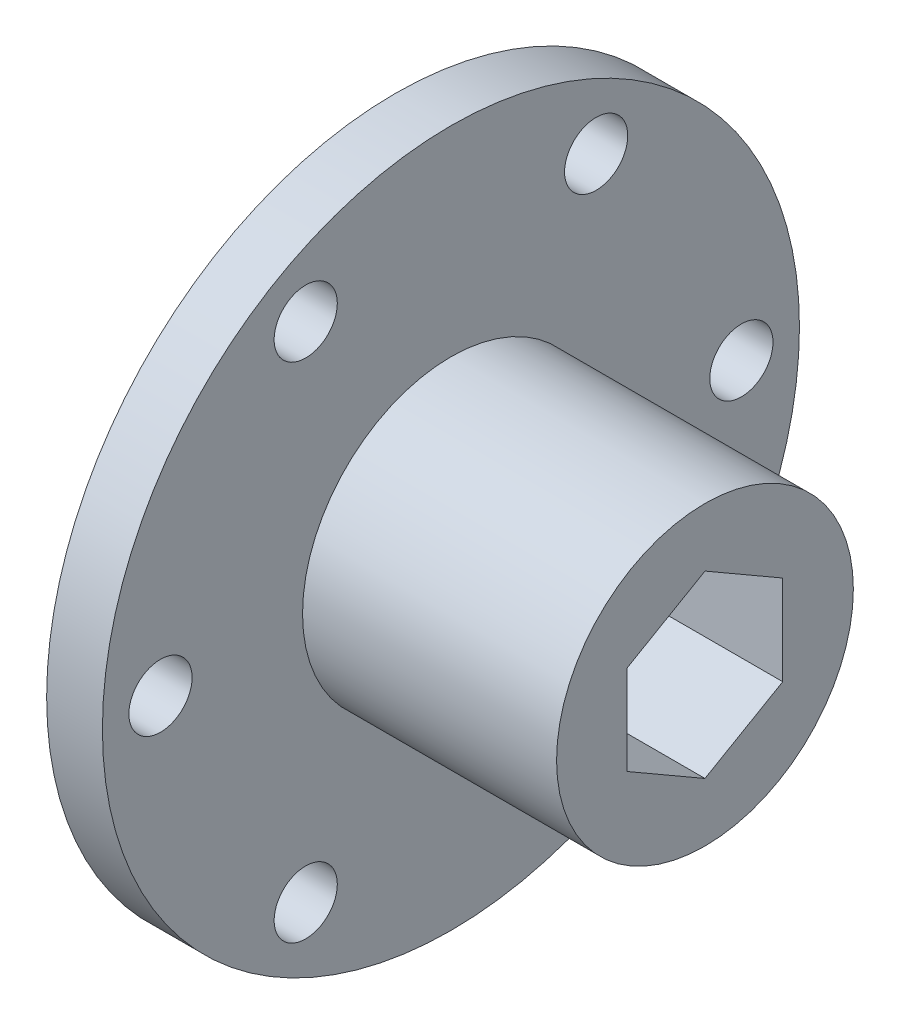
ISO-10303-21;
HEADER;
FILE_DESCRIPTION(('STEP AP214'),'2;1');
FILE_NAME('part.step','',(''),(''),'','','');
FILE_SCHEMA(('AUTOMOTIVE_DESIGN { 1 0 10303 214 1 1 1 1 }'));
ENDSEC;
DATA;
#1=APPLICATION_CONTEXT('core data for automotive mechanical design processes');
#2=APPLICATION_PROTOCOL_DEFINITION('international standard','automotive_design',2000,#1);
#3=PRODUCT_CONTEXT('',#1,'mechanical');
#4=PRODUCT('Part','Part','',(#3));
#5=PRODUCT_RELATED_PRODUCT_CATEGORY('part','',(#4));
#6=PRODUCT_DEFINITION_FORMATION('','',#4);
#7=PRODUCT_DEFINITION_CONTEXT('part definition',#1,'design');
#8=PRODUCT_DEFINITION('design','',#6,#7);
#9=PRODUCT_DEFINITION_SHAPE('','',#8);
#10=(LENGTH_UNIT() NAMED_UNIT(*) SI_UNIT(.MILLI.,.METRE.));
#11=(NAMED_UNIT(*) PLANE_ANGLE_UNIT() SI_UNIT($,.RADIAN.));
#12=(NAMED_UNIT(*) SI_UNIT($,.STERADIAN.) SOLID_ANGLE_UNIT());
#13=UNCERTAINTY_MEASURE_WITH_UNIT(LENGTH_MEASURE(1.E-05),#10,'distance_accuracy_value','');
#14=(GEOMETRIC_REPRESENTATION_CONTEXT(3) GLOBAL_UNCERTAINTY_ASSIGNED_CONTEXT((#13)) GLOBAL_UNIT_ASSIGNED_CONTEXT((#10,
#11,#12)) REPRESENTATION_CONTEXT('',''));
#15=CARTESIAN_POINT('',(0.,0.,0.));
#16=DIRECTION('',(0.,0.,1.));
#17=DIRECTION('',(1.,0.,0.));
#18=AXIS2_PLACEMENT_3D('',#15,#16,#17);
#19=CARTESIAN_POINT('',(-13.0350662460568,0.,0.));
#20=DIRECTION('',(1.,0.,0.));
#21=DIRECTION('',(0.,0.,-1.));
#22=AXIS2_PLACEMENT_3D('',#19,#20,#21);
#23=PLANE('',#22);
#24=CARTESIAN_POINT('',(-13.0350662460568,-20.6222299276169,11.90625));
#25=DIRECTION('',(1.,0.,0.));
#26=DIRECTION('',(0.,0.,-1.));
#27=AXIS2_PLACEMENT_3D('',#24,#25,#26);
#28=CIRCLE('',#27,2.59080000000001);
#29=CARTESIAN_POINT('',(-13.0350662460568,-20.6222299276169,9.31544999999996));
#30=VERTEX_POINT('',#29);
#31=EDGE_CURVE('E220',#30,#30,#28,.T.);
#32=ORIENTED_EDGE('',*,*,#31,.F.);
#33=EDGE_LOOP('',(#32));
#34=FACE_BOUND('',#33,.T.);
#35=CARTESIAN_POINT('',(-13.0350662460568,-20.6222299276169,-11.90625));
#36=DIRECTION('',(1.,0.,0.));
#37=DIRECTION('',(0.,0.,-1.));
#38=AXIS2_PLACEMENT_3D('',#35,#36,#37);
#39=CIRCLE('',#38,2.59080000000001);
#40=CARTESIAN_POINT('',(-13.0350662460568,-20.6222299276169,-14.49705));
#41=VERTEX_POINT('',#40);
#42=EDGE_CURVE('E230',#41,#41,#39,.T.);
#43=ORIENTED_EDGE('',*,*,#42,.F.);
#44=EDGE_LOOP('',(#43));
#45=FACE_BOUND('',#44,.T.);
#46=CARTESIAN_POINT('',(-13.0350662460568,0.,-23.8125));
#47=DIRECTION('',(1.,0.,0.));
#48=DIRECTION('',(0.,0.,-1.));
#49=AXIS2_PLACEMENT_3D('',#46,#47,#48);
#50=CIRCLE('',#49,2.59080000000001);
#51=CARTESIAN_POINT('',(-13.0350662460568,0.,-26.4033));
#52=VERTEX_POINT('',#51);
#53=EDGE_CURVE('E236',#52,#52,#50,.T.);
#54=ORIENTED_EDGE('',*,*,#53,.F.);
#55=EDGE_LOOP('',(#54));
#56=FACE_BOUND('',#55,.T.);
#57=CARTESIAN_POINT('',(-13.0350662460568,20.6222299276169,-11.90625));
#58=DIRECTION('',(1.,0.,0.));
#59=DIRECTION('',(0.,0.,-1.));
#60=AXIS2_PLACEMENT_3D('',#57,#58,#59);
#61=CIRCLE('',#60,2.59080000000001);
#62=CARTESIAN_POINT('',(-13.0350662460568,20.6222299276169,-14.49705));
#63=VERTEX_POINT('',#62);
#64=EDGE_CURVE('E242',#63,#63,#61,.T.);
#65=ORIENTED_EDGE('',*,*,#64,.F.);
#66=EDGE_LOOP('',(#65));
#67=FACE_BOUND('',#66,.T.);
#68=CARTESIAN_POINT('',(-13.0350662460568,20.6222299276169,11.90625));
#69=DIRECTION('',(1.,0.,0.));
#70=DIRECTION('',(0.,0.,-1.));
#71=AXIS2_PLACEMENT_3D('',#68,#69,#70);
#72=CIRCLE('',#71,2.59080000000001);
#73=CARTESIAN_POINT('',(-13.0350662460568,20.6222299276169,9.31544999999999));
#74=VERTEX_POINT('',#73);
#75=EDGE_CURVE('E248',#74,#74,#72,.T.);
#76=ORIENTED_EDGE('',*,*,#75,.F.);
#77=EDGE_LOOP('',(#76));
#78=FACE_BOUND('',#77,.T.);
#79=CARTESIAN_POINT('',(-13.0350662460568,0.,23.8125));
#80=DIRECTION('',(1.,0.,0.));
#81=DIRECTION('',(0.,0.,-1.));
#82=AXIS2_PLACEMENT_3D('',#79,#80,#81);
#83=CIRCLE('',#82,2.59080000000001);
#84=CARTESIAN_POINT('',(-13.0350662460568,0.,21.2217));
#85=VERTEX_POINT('',#84);
#86=EDGE_CURVE('E111',#85,#85,#83,.T.);
#87=ORIENTED_EDGE('',*,*,#86,.F.);
#88=EDGE_LOOP('',(#87));
#89=FACE_BOUND('',#88,.T.);
#90=CARTESIAN_POINT('',(-13.0350662460568,0.,0.));
#91=DIRECTION('',(1.,0.,0.));
#92=DIRECTION('',(0.,0.,-1.));
#93=AXIS2_PLACEMENT_3D('',#90,#91,#92);
#94=CIRCLE('',#93,28.575);
#95=CARTESIAN_POINT('',(-13.0350662460568,0.,-28.575));
#96=VERTEX_POINT('',#95);
#97=EDGE_CURVE('E41',#96,#96,#94,.T.);
#98=ORIENTED_EDGE('',*,*,#97,.T.);
#99=EDGE_LOOP('',(#98));
#100=FACE_BOUND('',#99,.T.);
#101=CARTESIAN_POINT('',(-13.0350662460568,0.,0.));
#102=DIRECTION('',(1.,0.,0.));
#103=DIRECTION('',(0.,0.,-1.));
#104=AXIS2_PLACEMENT_3D('',#101,#102,#103);
#105=CIRCLE('',#104,12.1666);
#106=CARTESIAN_POINT('',(-13.0350662460568,0.,-12.1666));
#107=VERTEX_POINT('',#106);
#108=EDGE_CURVE('E134',#107,#107,#105,.T.);
#109=ORIENTED_EDGE('',*,*,#108,.F.);
#110=EDGE_LOOP('',(#109));
#111=FACE_BOUND('',#110,.T.);
#112=ADVANCED_FACE('F33',(#34,#45,#56,#67,#78,#89,#100,#111),#23,.T.);
#113=CARTESIAN_POINT('',(-17.6070662460568,0.,0.));
#114=DIRECTION('',(1.,0.,0.));
#115=DIRECTION('',(0.,0.,-1.));
#116=AXIS2_PLACEMENT_3D('',#113,#114,#115);
#117=CYLINDRICAL_SURFACE('',#116,28.575);
#118=CARTESIAN_POINT('',(-17.6070662460568,0.,0.));
#119=DIRECTION('',(1.,0.,0.));
#120=DIRECTION('',(0.,0.,-1.));
#121=AXIS2_PLACEMENT_3D('',#118,#119,#120);
#122=CIRCLE('',#121,28.575);
#123=CARTESIAN_POINT('',(-17.6070662460568,0.,-28.575));
#124=VERTEX_POINT('',#123);
#125=EDGE_CURVE('E11',#124,#124,#122,.T.);
#126=ORIENTED_EDGE('',*,*,#125,.T.);
#127=EDGE_LOOP('',(#126));
#128=FACE_BOUND('',#127,.T.);
#129=ORIENTED_EDGE('',*,*,#97,.F.);
#130=EDGE_LOOP('',(#129));
#131=FACE_BOUND('',#130,.T.);
#132=ADVANCED_FACE('F35',(#128,#131),#117,.T.);
#133=CARTESIAN_POINT('',(-17.6070662460568,28.575,0.));
#134=DIRECTION('',(-1.,0.,0.));
#135=DIRECTION('',(0.,0.,1.));
#136=AXIS2_PLACEMENT_3D('',#133,#134,#135);
#137=PLANE('',#136);
#138=CARTESIAN_POINT('',(-17.6070662460568,-20.6222299276169,11.90625));
#139=DIRECTION('',(-1.,0.,0.));
#140=DIRECTION('',(0.,0.,1.));
#141=AXIS2_PLACEMENT_3D('',#138,#139,#140);
#142=CIRCLE('',#141,2.59080000000001);
#143=CARTESIAN_POINT('',(-17.6070662460568,-20.6222299276169,14.49705));
#144=VERTEX_POINT('',#143);
#145=EDGE_CURVE('E223',#144,#144,#142,.T.);
#146=ORIENTED_EDGE('',*,*,#145,.F.);
#147=EDGE_LOOP('',(#146));
#148=FACE_BOUND('',#147,.T.);
#149=CARTESIAN_POINT('',(-17.6070662460568,-20.6222299276169,-11.90625));
#150=DIRECTION('',(-1.,0.,0.));
#151=DIRECTION('',(0.,0.,1.));
#152=AXIS2_PLACEMENT_3D('',#149,#150,#151);
#153=CIRCLE('',#152,2.59080000000001);
#154=CARTESIAN_POINT('',(-17.6070662460568,-20.6222299276169,-9.31544999999999));
#155=VERTEX_POINT('',#154);
#156=EDGE_CURVE('E225',#155,#155,#153,.T.);
#157=ORIENTED_EDGE('',*,*,#156,.F.);
#158=EDGE_LOOP('',(#157));
#159=FACE_BOUND('',#158,.T.);
#160=CARTESIAN_POINT('',(-17.6070662460568,0.,-23.8125));
#161=DIRECTION('',(-1.,0.,0.));
#162=DIRECTION('',(0.,0.,1.));
#163=AXIS2_PLACEMENT_3D('',#160,#161,#162);
#164=CIRCLE('',#163,2.59080000000001);
#165=CARTESIAN_POINT('',(-17.6070662460568,0.,-21.2217));
#166=VERTEX_POINT('',#165);
#167=EDGE_CURVE('E233',#166,#166,#164,.T.);
#168=ORIENTED_EDGE('',*,*,#167,.F.);
#169=EDGE_LOOP('',(#168));
#170=FACE_BOUND('',#169,.T.);
#171=CARTESIAN_POINT('',(-17.6070662460568,20.6222299276169,-11.90625));
#172=DIRECTION('',(-1.,0.,0.));
#173=DIRECTION('',(0.,0.,1.));
#174=AXIS2_PLACEMENT_3D('',#171,#172,#173);
#175=CIRCLE('',#174,2.59080000000001);
#176=CARTESIAN_POINT('',(-17.6070662460568,20.6222299276169,-9.31544999999999));
#177=VERTEX_POINT('',#176);
#178=EDGE_CURVE('E239',#177,#177,#175,.T.);
#179=ORIENTED_EDGE('',*,*,#178,.F.);
#180=EDGE_LOOP('',(#179));
#181=FACE_BOUND('',#180,.T.);
#182=CARTESIAN_POINT('',(-17.6070662460568,20.6222299276169,11.90625));
#183=DIRECTION('',(-1.,0.,0.));
#184=DIRECTION('',(0.,0.,1.));
#185=AXIS2_PLACEMENT_3D('',#182,#183,#184);
#186=CIRCLE('',#185,2.59080000000001);
#187=CARTESIAN_POINT('',(-17.6070662460568,20.6222299276169,14.49705));
#188=VERTEX_POINT('',#187);
#189=EDGE_CURVE('E245',#188,#188,#186,.T.);
#190=ORIENTED_EDGE('',*,*,#189,.F.);
#191=EDGE_LOOP('',(#190));
#192=FACE_BOUND('',#191,.T.);
#193=CARTESIAN_POINT('',(-17.6070662460568,0.,23.8125));
#194=DIRECTION('',(-1.,0.,0.));
#195=DIRECTION('',(0.,0.,1.));
#196=AXIS2_PLACEMENT_3D('',#193,#194,#195);
#197=CIRCLE('',#196,2.59080000000001);
#198=CARTESIAN_POINT('',(-17.6070662460568,0.,26.4033));
#199=VERTEX_POINT('',#198);
#200=EDGE_CURVE('E250',#199,#199,#197,.T.);
#201=ORIENTED_EDGE('',*,*,#200,.F.);
#202=EDGE_LOOP('',(#201));
#203=FACE_BOUND('',#202,.T.);
#204=DIRECTION('',(0.,-0.5,0.866025403784438));
#205=VECTOR('',#204,1.);
#206=CARTESIAN_POINT('',(-17.6070662460568,-3.68085890619154,-6.3754));
#207=LINE('',#206,#205);
#208=CARTESIAN_POINT('',(-17.6070662460568,-3.68085890619154,-6.3754));
#209=VERTEX_POINT('',#208);
#210=CARTESIAN_POINT('',(-17.6070662460568,-7.36169781238309,0.));
#211=VERTEX_POINT('',#210);
#212=EDGE_CURVE('E48',#209,#211,#207,.T.);
#213=ORIENTED_EDGE('',*,*,#212,.F.);
#214=DIRECTION('',(0.,-1.,0.));
#215=VECTOR('',#214,1.);
#216=CARTESIAN_POINT('',(-17.6070662460568,3.68081890619155,-6.3754));
#217=LINE('',#216,#215);
#218=CARTESIAN_POINT('',(-17.6070662460568,3.68081890619155,-6.3754));
#219=VERTEX_POINT('',#218);
#220=EDGE_CURVE('E105',#219,#209,#217,.T.);
#221=ORIENTED_EDGE('',*,*,#220,.F.);
#222=DIRECTION('',(0.,-0.5,-0.866025403784439));
#223=VECTOR('',#222,1.);
#224=CARTESIAN_POINT('',(-17.6070662460568,7.36165781238309,0.));
#225=LINE('',#224,#223);
#226=CARTESIAN_POINT('',(-17.6070662460568,7.36165781238309,0.));
#227=VERTEX_POINT('',#226);
#228=EDGE_CURVE('E108',#227,#219,#225,.T.);
#229=ORIENTED_EDGE('',*,*,#228,.F.);
#230=DIRECTION('',(0.,0.5,-0.866025403784439));
#231=VECTOR('',#230,1.);
#232=CARTESIAN_POINT('',(-17.6070662460568,3.68081890619155,6.3754));
#233=LINE('',#232,#231);
#234=CARTESIAN_POINT('',(-17.6070662460568,3.68081890619155,6.3754));
#235=VERTEX_POINT('',#234);
#236=EDGE_CURVE('E127',#235,#227,#233,.T.);
#237=ORIENTED_EDGE('',*,*,#236,.F.);
#238=DIRECTION('',(0.,1.,0.));
#239=VECTOR('',#238,1.);
#240=CARTESIAN_POINT('',(-17.6070662460568,-3.68085890619154,6.3754));
#241=LINE('',#240,#239);
#242=CARTESIAN_POINT('',(-17.6070662460568,-3.68085890619154,6.3754));
#243=VERTEX_POINT('',#242);
#244=EDGE_CURVE('E124',#243,#235,#241,.T.);
#245=ORIENTED_EDGE('',*,*,#244,.F.);
#246=DIRECTION('',(0.,0.500000000000001,0.866025403784438));
#247=VECTOR('',#246,1.);
#248=CARTESIAN_POINT('',(-17.6070662460568,-7.36169781238309,0.));
#249=LINE('',#248,#247);
#250=EDGE_CURVE('E122',#211,#243,#249,.T.);
#251=ORIENTED_EDGE('',*,*,#250,.F.);
#252=EDGE_LOOP('',(#213,#221,#229,#237,#245,#251));
#253=FACE_BOUND('',#252,.T.);
#254=ORIENTED_EDGE('',*,*,#125,.F.);
#255=EDGE_LOOP('',(#254));
#256=FACE_BOUND('',#255,.T.);
#257=ADVANCED_FACE('F152',(#148,#159,#170,#181,#192,#203,#253,#256),#137,.T.);
#258=CARTESIAN_POINT('',(7.79293375394323,0.,0.));
#259=DIRECTION('',(-1.,0.,0.));
#260=DIRECTION('',(0.,0.,1.));
#261=AXIS2_PLACEMENT_3D('',#258,#259,#260);
#262=CYLINDRICAL_SURFACE('',#261,12.1666);
#263=CARTESIAN_POINT('',(7.79293375394323,0.,0.));
#264=DIRECTION('',(1.,0.,0.));
#265=DIRECTION('',(0.,0.,-1.));
#266=AXIS2_PLACEMENT_3D('',#263,#264,#265);
#267=CIRCLE('',#266,12.1666);
#268=CARTESIAN_POINT('',(7.79293375394323,0.,-12.1666));
#269=VERTEX_POINT('',#268);
#270=EDGE_CURVE('E142',#269,#269,#267,.T.);
#271=ORIENTED_EDGE('',*,*,#270,.F.);
#272=EDGE_LOOP('',(#271));
#273=FACE_BOUND('',#272,.T.);
#274=ORIENTED_EDGE('',*,*,#108,.T.);
#275=EDGE_LOOP('',(#274));
#276=FACE_BOUND('',#275,.T.);
#277=ADVANCED_FACE('F158',(#273,#276),#262,.T.);
#278=CARTESIAN_POINT('',(7.79293375394323,0.,0.));
#279=DIRECTION('',(1.,0.,0.));
#280=DIRECTION('',(0.,0.,-1.));
#281=AXIS2_PLACEMENT_3D('',#278,#279,#280);
#282=PLANE('',#281);
#283=DIRECTION('',(0.,-0.5,0.866025403784438));
#284=VECTOR('',#283,1.);
#285=CARTESIAN_POINT('',(7.79293375394323,-3.68085890619154,-6.3754));
#286=LINE('',#285,#284);
#287=CARTESIAN_POINT('',(7.79293375394323,-3.68085890619154,-6.3754));
#288=VERTEX_POINT('',#287);
#289=CARTESIAN_POINT('',(7.79293375394323,-7.36169781238309,0.));
#290=VERTEX_POINT('',#289);
#291=EDGE_CURVE('E88',#288,#290,#286,.T.);
#292=ORIENTED_EDGE('',*,*,#291,.T.);
#293=DIRECTION('',(0.,0.500000000000001,0.866025403784438));
#294=VECTOR('',#293,1.);
#295=CARTESIAN_POINT('',(7.79293375394323,-7.36169781238309,0.));
#296=LINE('',#295,#294);
#297=CARTESIAN_POINT('',(7.79293375394323,-3.68085890619154,6.3754));
#298=VERTEX_POINT('',#297);
#299=EDGE_CURVE('E97',#290,#298,#296,.T.);
#300=ORIENTED_EDGE('',*,*,#299,.T.);
#301=DIRECTION('',(0.,1.,0.));
#302=VECTOR('',#301,1.);
#303=CARTESIAN_POINT('',(7.79293375394323,-3.68085890619154,6.3754));
#304=LINE('',#303,#302);
#305=CARTESIAN_POINT('',(7.79293375394323,3.68081890619155,6.3754));
#306=VERTEX_POINT('',#305);
#307=EDGE_CURVE('E56',#298,#306,#304,.T.);
#308=ORIENTED_EDGE('',*,*,#307,.T.);
#309=DIRECTION('',(0.,0.5,-0.866025403784439));
#310=VECTOR('',#309,1.);
#311=CARTESIAN_POINT('',(7.79293375394323,3.68081890619155,6.3754));
#312=LINE('',#311,#310);
#313=CARTESIAN_POINT('',(7.79293375394323,7.36165781238309,0.));
#314=VERTEX_POINT('',#313);
#315=EDGE_CURVE('E115',#306,#314,#312,.T.);
#316=ORIENTED_EDGE('',*,*,#315,.T.);
#317=DIRECTION('',(0.,-0.5,-0.866025403784439));
#318=VECTOR('',#317,1.);
#319=CARTESIAN_POINT('',(7.79293375394323,7.36165781238309,0.));
#320=LINE('',#319,#318);
#321=CARTESIAN_POINT('',(7.79293375394323,3.68081890619155,-6.3754));
#322=VERTEX_POINT('',#321);
#323=EDGE_CURVE('E118',#314,#322,#320,.T.);
#324=ORIENTED_EDGE('',*,*,#323,.T.);
#325=DIRECTION('',(0.,-1.,0.));
#326=VECTOR('',#325,1.);
#327=CARTESIAN_POINT('',(7.79293375394323,3.68081890619155,-6.3754));
#328=LINE('',#327,#326);
#329=EDGE_CURVE('E94',#322,#288,#328,.T.);
#330=ORIENTED_EDGE('',*,*,#329,.T.);
#331=EDGE_LOOP('',(#292,#300,#308,#316,#324,#330));
#332=FACE_BOUND('',#331,.T.);
#333=ORIENTED_EDGE('',*,*,#270,.T.);
#334=EDGE_LOOP('',(#333));
#335=FACE_BOUND('',#334,.T.);
#336=ADVANCED_FACE('F101',(#332,#335),#282,.T.);
#337=CARTESIAN_POINT('',(7.79293375394323,-3.68085890619154,-6.3754));
#338=DIRECTION('',(0.,-0.866025403784438,-0.5));
#339=DIRECTION('',(0.,0.5,-0.866025403784439));
#340=AXIS2_PLACEMENT_3D('',#337,#338,#339);
#341=PLANE('',#340);
#342=ORIENTED_EDGE('',*,*,#212,.T.);
#343=DIRECTION('',(-1.,0.,0.));
#344=VECTOR('',#343,1.);
#345=CARTESIAN_POINT('',(7.79293375394323,-7.36169781238309,0.));
#346=LINE('',#345,#344);
#347=EDGE_CURVE('E84',#290,#211,#346,.T.);
#348=ORIENTED_EDGE('',*,*,#347,.F.);
#349=ORIENTED_EDGE('',*,*,#291,.F.);
#350=DIRECTION('',(-1.,0.,0.));
#351=VECTOR('',#350,1.);
#352=CARTESIAN_POINT('',(7.79293375394323,-3.68085890619154,-6.3754));
#353=LINE('',#352,#351);
#354=EDGE_CURVE('E132',#288,#209,#353,.T.);
#355=ORIENTED_EDGE('',*,*,#354,.T.);
#356=EDGE_LOOP('',(#342,#348,#349,#355));
#357=FACE_BOUND('',#356,.T.);
#358=ADVANCED_FACE('F86',(#357),#341,.F.);
#359=CARTESIAN_POINT('',(7.79293375394323,3.68081890619155,-6.3754));
#360=DIRECTION('',(0.,0.,-1.));
#361=DIRECTION('',(0.,1.,0.));
#362=AXIS2_PLACEMENT_3D('',#359,#360,#361);
#363=PLANE('',#362);
#364=ORIENTED_EDGE('',*,*,#220,.T.);
#365=ORIENTED_EDGE('',*,*,#354,.F.);
#366=ORIENTED_EDGE('',*,*,#329,.F.);
#367=DIRECTION('',(-1.,0.,0.));
#368=VECTOR('',#367,1.);
#369=CARTESIAN_POINT('',(7.79293375394323,3.68081890619155,-6.3754));
#370=LINE('',#369,#368);
#371=EDGE_CURVE('E135',#322,#219,#370,.T.);
#372=ORIENTED_EDGE('',*,*,#371,.T.);
#373=EDGE_LOOP('',(#364,#365,#366,#372));
#374=FACE_BOUND('',#373,.T.);
#375=ADVANCED_FACE('F176',(#374),#363,.F.);
#376=CARTESIAN_POINT('',(7.79293375394323,7.36165781238309,0.));
#377=DIRECTION('',(0.,0.866025403784439,-0.5));
#378=DIRECTION('',(0.,0.5,0.866025403784439));
#379=AXIS2_PLACEMENT_3D('',#376,#377,#378);
#380=PLANE('',#379);
#381=ORIENTED_EDGE('',*,*,#228,.T.);
#382=ORIENTED_EDGE('',*,*,#371,.F.);
#383=ORIENTED_EDGE('',*,*,#323,.F.);
#384=DIRECTION('',(-1.,0.,0.));
#385=VECTOR('',#384,1.);
#386=CARTESIAN_POINT('',(7.79293375394323,7.36165781238309,0.));
#387=LINE('',#386,#385);
#388=EDGE_CURVE('E137',#314,#227,#387,.T.);
#389=ORIENTED_EDGE('',*,*,#388,.T.);
#390=EDGE_LOOP('',(#381,#382,#383,#389));
#391=FACE_BOUND('',#390,.T.);
#392=ADVANCED_FACE('F186',(#391),#380,.F.);
#393=CARTESIAN_POINT('',(7.79293375394323,3.68081890619155,6.3754));
#394=DIRECTION('',(0.,0.866025403784439,0.5));
#395=DIRECTION('',(0.,-0.5,0.866025403784439));
#396=AXIS2_PLACEMENT_3D('',#393,#394,#395);
#397=PLANE('',#396);
#398=ORIENTED_EDGE('',*,*,#236,.T.);
#399=ORIENTED_EDGE('',*,*,#388,.F.);
#400=ORIENTED_EDGE('',*,*,#315,.F.);
#401=DIRECTION('',(-1.,0.,0.));
#402=VECTOR('',#401,1.);
#403=CARTESIAN_POINT('',(7.79293375394323,3.68081890619155,6.3754));
#404=LINE('',#403,#402);
#405=EDGE_CURVE('E139',#306,#235,#404,.T.);
#406=ORIENTED_EDGE('',*,*,#405,.T.);
#407=EDGE_LOOP('',(#398,#399,#400,#406));
#408=FACE_BOUND('',#407,.T.);
#409=ADVANCED_FACE('F183',(#408),#397,.F.);
#410=CARTESIAN_POINT('',(7.79293375394323,-3.68085890619154,6.3754));
#411=DIRECTION('',(0.,0.,1.));
#412=DIRECTION('',(0.,-1.,0.));
#413=AXIS2_PLACEMENT_3D('',#410,#411,#412);
#414=PLANE('',#413);
#415=ORIENTED_EDGE('',*,*,#244,.T.);
#416=ORIENTED_EDGE('',*,*,#405,.F.);
#417=ORIENTED_EDGE('',*,*,#307,.F.);
#418=DIRECTION('',(-1.,0.,0.));
#419=VECTOR('',#418,1.);
#420=CARTESIAN_POINT('',(7.79293375394323,-3.68085890619154,6.3754));
#421=LINE('',#420,#419);
#422=EDGE_CURVE('E93',#298,#243,#421,.T.);
#423=ORIENTED_EDGE('',*,*,#422,.T.);
#424=EDGE_LOOP('',(#415,#416,#417,#423));
#425=FACE_BOUND('',#424,.T.);
#426=ADVANCED_FACE('F180',(#425),#414,.F.);
#427=CARTESIAN_POINT('',(7.79293375394323,-7.36169781238309,0.));
#428=DIRECTION('',(0.,-0.866025403784438,0.500000000000001));
#429=DIRECTION('',(0.,-0.500000000000001,-0.866025403784438));
#430=AXIS2_PLACEMENT_3D('',#427,#428,#429);
#431=PLANE('',#430);
#432=ORIENTED_EDGE('',*,*,#250,.T.);
#433=ORIENTED_EDGE('',*,*,#422,.F.);
#434=ORIENTED_EDGE('',*,*,#299,.F.);
#435=ORIENTED_EDGE('',*,*,#347,.T.);
#436=EDGE_LOOP('',(#432,#433,#434,#435));
#437=FACE_BOUND('',#436,.T.);
#438=ADVANCED_FACE('F98',(#437),#431,.F.);
#439=CARTESIAN_POINT('',(-17.6070662460568,0.,23.8125));
#440=DIRECTION('',(-1.,0.,0.));
#441=DIRECTION('',(0.,0.,1.));
#442=AXIS2_PLACEMENT_3D('',#439,#440,#441);
#443=CYLINDRICAL_SURFACE('',#442,2.59080000000001);
#444=ORIENTED_EDGE('',*,*,#86,.T.);
#445=EDGE_LOOP('',(#444));
#446=FACE_BOUND('',#445,.T.);
#447=ORIENTED_EDGE('',*,*,#200,.T.);
#448=EDGE_LOOP('',(#447));
#449=FACE_BOUND('',#448,.T.);
#450=ADVANCED_FACE('F179',(#446,#449),#443,.F.);
#451=CARTESIAN_POINT('',(-17.6070662460568,20.6222299276169,11.90625));
#452=DIRECTION('',(-1.,0.,0.));
#453=DIRECTION('',(0.,0.,1.));
#454=AXIS2_PLACEMENT_3D('',#451,#452,#453);
#455=CYLINDRICAL_SURFACE('',#454,2.59080000000001);
#456=ORIENTED_EDGE('',*,*,#75,.T.);
#457=EDGE_LOOP('',(#456));
#458=FACE_BOUND('',#457,.T.);
#459=ORIENTED_EDGE('',*,*,#189,.T.);
#460=EDGE_LOOP('',(#459));
#461=FACE_BOUND('',#460,.T.);
#462=ADVANCED_FACE('F196',(#458,#461),#455,.F.);
#463=CARTESIAN_POINT('',(-17.6070662460568,20.6222299276169,-11.90625));
#464=DIRECTION('',(-1.,0.,0.));
#465=DIRECTION('',(0.,0.,1.));
#466=AXIS2_PLACEMENT_3D('',#463,#464,#465);
#467=CYLINDRICAL_SURFACE('',#466,2.59080000000001);
#468=ORIENTED_EDGE('',*,*,#64,.T.);
#469=EDGE_LOOP('',(#468));
#470=FACE_BOUND('',#469,.T.);
#471=ORIENTED_EDGE('',*,*,#178,.T.);
#472=EDGE_LOOP('',(#471));
#473=FACE_BOUND('',#472,.T.);
#474=ADVANCED_FACE('F200',(#470,#473),#467,.F.);
#475=CARTESIAN_POINT('',(-17.6070662460568,0.,-23.8125));
#476=DIRECTION('',(-1.,0.,0.));
#477=DIRECTION('',(0.,0.,1.));
#478=AXIS2_PLACEMENT_3D('',#475,#476,#477);
#479=CYLINDRICAL_SURFACE('',#478,2.59080000000001);
#480=ORIENTED_EDGE('',*,*,#53,.T.);
#481=EDGE_LOOP('',(#480));
#482=FACE_BOUND('',#481,.T.);
#483=ORIENTED_EDGE('',*,*,#167,.T.);
#484=EDGE_LOOP('',(#483));
#485=FACE_BOUND('',#484,.T.);
#486=ADVANCED_FACE('F204',(#482,#485),#479,.F.);
#487=CARTESIAN_POINT('',(-17.6070662460568,-20.6222299276169,-11.90625));
#488=DIRECTION('',(-1.,0.,0.));
#489=DIRECTION('',(0.,0.,1.));
#490=AXIS2_PLACEMENT_3D('',#487,#488,#489);
#491=CYLINDRICAL_SURFACE('',#490,2.59080000000001);
#492=ORIENTED_EDGE('',*,*,#42,.T.);
#493=EDGE_LOOP('',(#492));
#494=FACE_BOUND('',#493,.T.);
#495=ORIENTED_EDGE('',*,*,#156,.T.);
#496=EDGE_LOOP('',(#495));
#497=FACE_BOUND('',#496,.T.);
#498=ADVANCED_FACE('F208',(#494,#497),#491,.F.);
#499=CARTESIAN_POINT('',(-17.6070662460568,-20.6222299276169,11.90625));
#500=DIRECTION('',(-1.,0.,0.));
#501=DIRECTION('',(0.,0.,1.));
#502=AXIS2_PLACEMENT_3D('',#499,#500,#501);
#503=CYLINDRICAL_SURFACE('',#502,2.59080000000001);
#504=ORIENTED_EDGE('',*,*,#31,.T.);
#505=EDGE_LOOP('',(#504));
#506=FACE_BOUND('',#505,.T.);
#507=ORIENTED_EDGE('',*,*,#145,.T.);
#508=EDGE_LOOP('',(#507));
#509=FACE_BOUND('',#508,.T.);
#510=ADVANCED_FACE('F212',(#506,#509),#503,.F.);
#511=CLOSED_SHELL('',(#112,#132,#257,#277,#336,#358,#375,#392,#409,#426,#438,#450,#462,#474,
#486,#498,#510));
#512=MANIFOLD_SOLID_BREP('B2',#511);
#513=ADVANCED_BREP_SHAPE_REPRESENTATION('',(#18,#512),#14);
#514=SHAPE_DEFINITION_REPRESENTATION(#9,#513);
ENDSEC;
END-ISO-10303-21;
